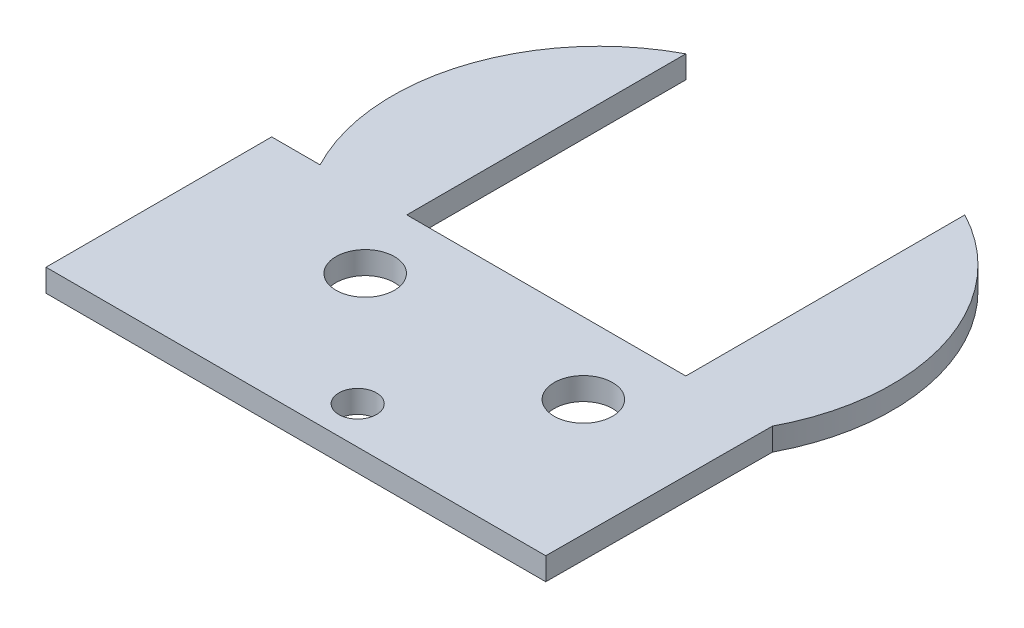
ISO-10303-21;
HEADER;
FILE_DESCRIPTION(('STEP AP214'),'2;1');
FILE_NAME('part.step','',(''),(''),'','','');
FILE_SCHEMA(('AUTOMOTIVE_DESIGN { 1 0 10303 214 1 1 1 1 }'));
ENDSEC;
DATA;
#1=APPLICATION_CONTEXT('core data for automotive mechanical design processes');
#2=APPLICATION_PROTOCOL_DEFINITION('international standard','automotive_design',2000,#1);
#3=PRODUCT_CONTEXT('',#1,'mechanical');
#4=PRODUCT('Part','Part','',(#3));
#5=PRODUCT_RELATED_PRODUCT_CATEGORY('part','',(#4));
#6=PRODUCT_DEFINITION_FORMATION('','',#4);
#7=PRODUCT_DEFINITION_CONTEXT('part definition',#1,'design');
#8=PRODUCT_DEFINITION('design','',#6,#7);
#9=PRODUCT_DEFINITION_SHAPE('','',#8);
#10=(LENGTH_UNIT() NAMED_UNIT(*) SI_UNIT(.MILLI.,.METRE.));
#11=(NAMED_UNIT(*) PLANE_ANGLE_UNIT() SI_UNIT($,.RADIAN.));
#12=(NAMED_UNIT(*) SI_UNIT($,.STERADIAN.) SOLID_ANGLE_UNIT());
#13=UNCERTAINTY_MEASURE_WITH_UNIT(LENGTH_MEASURE(1.E-05),#10,'distance_accuracy_value','');
#14=(GEOMETRIC_REPRESENTATION_CONTEXT(3) GLOBAL_UNCERTAINTY_ASSIGNED_CONTEXT((#13)) GLOBAL_UNIT_ASSIGNED_CONTEXT((#10,
#11,#12)) REPRESENTATION_CONTEXT('',''));
#15=CARTESIAN_POINT('',(0.,0.,0.));
#16=DIRECTION('',(0.,0.,1.));
#17=DIRECTION('',(1.,0.,0.));
#18=AXIS2_PLACEMENT_3D('',#15,#16,#17);
#19=CARTESIAN_POINT('',(-19.773849265644,3.,0.));
#20=DIRECTION('',(-1.,0.,0.));
#21=DIRECTION('',(0.,0.,1.));
#22=AXIS2_PLACEMENT_3D('',#19,#20,#21);
#23=PLANE('',#22);
#24=DIRECTION('',(0.,0.,-1.));
#25=VECTOR('',#24,1.);
#26=CARTESIAN_POINT('',(-19.773849265644,0.,0.));
#27=LINE('',#26,#25);
#28=CARTESIAN_POINT('',(-19.773849265644,0.,0.));
#29=VERTEX_POINT('',#28);
#30=CARTESIAN_POINT('',(-19.773849265644,0.,-37.0896151305009));
#31=VERTEX_POINT('',#30);
#32=EDGE_CURVE('E136',#29,#31,#27,.T.);
#33=ORIENTED_EDGE('',*,*,#32,.T.);
#34=DIRECTION('',(0.,-1.,0.));
#35=VECTOR('',#34,1.);
#36=CARTESIAN_POINT('',(-19.773849265644,3.,-37.0896151305009));
#37=LINE('',#36,#35);
#38=CARTESIAN_POINT('',(-19.773849265644,3.,-37.0896151305009));
#39=VERTEX_POINT('',#38);
#40=EDGE_CURVE('E11',#39,#31,#37,.T.);
#41=ORIENTED_EDGE('',*,*,#40,.F.);
#42=DIRECTION('',(0.,0.,-1.));
#43=VECTOR('',#42,1.);
#44=CARTESIAN_POINT('',(-19.773849265644,3.,0.));
#45=LINE('',#44,#43);
#46=CARTESIAN_POINT('',(-19.773849265644,3.,0.));
#47=VERTEX_POINT('',#46);
#48=EDGE_CURVE('E152',#47,#39,#45,.T.);
#49=ORIENTED_EDGE('',*,*,#48,.F.);
#50=DIRECTION('',(0.,-1.,0.));
#51=VECTOR('',#50,1.);
#52=CARTESIAN_POINT('',(-19.773849265644,3.,0.));
#53=LINE('',#52,#51);
#54=EDGE_CURVE('E132',#47,#29,#53,.T.);
#55=ORIENTED_EDGE('',*,*,#54,.T.);
#56=EDGE_LOOP('',(#33,#41,#49,#55));
#57=FACE_BOUND('',#56,.T.);
#58=ADVANCED_FACE('F33',(#57),#23,.F.);
#59=CARTESIAN_POINT('',(-6.99296837607949,3.,-12.7808808895645));
#60=DIRECTION('',(0.,-1.,0.));
#61=DIRECTION('',(0.,0.,-1.));
#62=AXIS2_PLACEMENT_3D('',#59,#60,#61);
#63=CYLINDRICAL_SURFACE('',#62,27.4638940558274);
#64=CARTESIAN_POINT('',(-6.99296837607949,0.,-12.7808808895645));
#65=DIRECTION('',(0.,1.,0.));
#66=DIRECTION('',(0.,0.,1.));
#67=AXIS2_PLACEMENT_3D('',#64,#65,#66);
#68=CIRCLE('',#67,27.4638940558274);
#69=CARTESIAN_POINT('',(-31.3017026170159,0.,0.));
#70=VERTEX_POINT('',#69);
#71=EDGE_CURVE('E139',#31,#70,#68,.T.);
#72=ORIENTED_EDGE('',*,*,#71,.T.);
#73=DIRECTION('',(0.,-1.,0.));
#74=VECTOR('',#73,1.);
#75=CARTESIAN_POINT('',(-31.3017026170159,3.,0.));
#76=LINE('',#75,#74);
#77=CARTESIAN_POINT('',(-31.3017026170159,3.,0.));
#78=VERTEX_POINT('',#77);
#79=EDGE_CURVE('E42',#78,#70,#76,.T.);
#80=ORIENTED_EDGE('',*,*,#79,.F.);
#81=CARTESIAN_POINT('',(-6.99296837607949,3.,-12.7808808895645));
#82=DIRECTION('',(0.,1.,0.));
#83=DIRECTION('',(0.,0.,1.));
#84=AXIS2_PLACEMENT_3D('',#81,#82,#83);
#85=CIRCLE('',#84,27.4638940558274);
#86=EDGE_CURVE('E96',#39,#78,#85,.T.);
#87=ORIENTED_EDGE('',*,*,#86,.F.);
#88=ORIENTED_EDGE('',*,*,#40,.T.);
#89=EDGE_LOOP('',(#72,#80,#87,#88));
#90=FACE_BOUND('',#89,.T.);
#91=ADVANCED_FACE('F232',(#90),#63,.T.);
#92=CARTESIAN_POINT('',(-37.7335480750406,3.,0.));
#93=DIRECTION('',(0.,0.,1.));
#94=DIRECTION('',(1.,0.,0.));
#95=AXIS2_PLACEMENT_3D('',#92,#93,#94);
#96=PLANE('',#95);
#97=DIRECTION('',(-1.,0.,0.));
#98=VECTOR('',#97,1.);
#99=CARTESIAN_POINT('',(-37.7335480750406,0.,0.));
#100=LINE('',#99,#98);
#101=CARTESIAN_POINT('',(-37.7335480750406,0.,0.));
#102=VERTEX_POINT('',#101);
#103=EDGE_CURVE('E141',#70,#102,#100,.T.);
#104=ORIENTED_EDGE('',*,*,#103,.T.);
#105=DIRECTION('',(0.,-1.,0.));
#106=VECTOR('',#105,1.);
#107=CARTESIAN_POINT('',(-37.7335480750406,3.,0.));
#108=LINE('',#107,#106);
#109=CARTESIAN_POINT('',(-37.7335480750406,3.,0.));
#110=VERTEX_POINT('',#109);
#111=EDGE_CURVE('E162',#110,#102,#108,.T.);
#112=ORIENTED_EDGE('',*,*,#111,.F.);
#113=DIRECTION('',(-1.,0.,0.));
#114=VECTOR('',#113,1.);
#115=CARTESIAN_POINT('',(-37.7335480750406,3.,0.));
#116=LINE('',#115,#114);
#117=EDGE_CURVE('E171',#78,#110,#116,.T.);
#118=ORIENTED_EDGE('',*,*,#117,.F.);
#119=ORIENTED_EDGE('',*,*,#79,.T.);
#120=EDGE_LOOP('',(#104,#112,#118,#119));
#121=FACE_BOUND('',#120,.T.);
#122=ADVANCED_FACE('F169',(#121),#96,.F.);
#123=CARTESIAN_POINT('',(-37.7335480750406,3.,30.));
#124=DIRECTION('',(1.,0.,0.));
#125=DIRECTION('',(0.,0.,-1.));
#126=AXIS2_PLACEMENT_3D('',#123,#124,#125);
#127=PLANE('',#126);
#128=DIRECTION('',(0.,0.,1.));
#129=VECTOR('',#128,1.);
#130=CARTESIAN_POINT('',(-37.7335480750406,0.,30.));
#131=LINE('',#130,#129);
#132=CARTESIAN_POINT('',(-37.7335480750406,0.,30.));
#133=VERTEX_POINT('',#132);
#134=EDGE_CURVE('E143',#102,#133,#131,.T.);
#135=ORIENTED_EDGE('',*,*,#134,.T.);
#136=DIRECTION('',(0.,-1.,0.));
#137=VECTOR('',#136,1.);
#138=CARTESIAN_POINT('',(-37.7335480750406,3.,30.));
#139=LINE('',#138,#137);
#140=CARTESIAN_POINT('',(-37.7335480750406,3.,30.));
#141=VERTEX_POINT('',#140);
#142=EDGE_CURVE('E159',#141,#133,#139,.T.);
#143=ORIENTED_EDGE('',*,*,#142,.F.);
#144=DIRECTION('',(0.,0.,1.));
#145=VECTOR('',#144,1.);
#146=CARTESIAN_POINT('',(-37.7335480750406,3.,30.));
#147=LINE('',#146,#145);
#148=EDGE_CURVE('E187',#110,#141,#147,.T.);
#149=ORIENTED_EDGE('',*,*,#148,.F.);
#150=ORIENTED_EDGE('',*,*,#111,.T.);
#151=EDGE_LOOP('',(#135,#143,#149,#150));
#152=FACE_BOUND('',#151,.T.);
#153=ADVANCED_FACE('F180',(#152),#127,.F.);
#154=CARTESIAN_POINT('',(-37.7335480750406,3.,30.));
#155=DIRECTION('',(0.,0.,-1.));
#156=DIRECTION('',(-1.,0.,0.));
#157=AXIS2_PLACEMENT_3D('',#154,#155,#156);
#158=PLANE('',#157);
#159=DIRECTION('',(1.,0.,0.));
#160=VECTOR('',#159,1.);
#161=CARTESIAN_POINT('',(-37.7335480750406,0.,30.));
#162=LINE('',#161,#160);
#163=CARTESIAN_POINT('',(28.6982973829841,0.,30.));
#164=VERTEX_POINT('',#163);
#165=EDGE_CURVE('E145',#133,#164,#162,.T.);
#166=ORIENTED_EDGE('',*,*,#165,.T.);
#167=DIRECTION('',(0.,-1.,0.));
#168=VECTOR('',#167,1.);
#169=CARTESIAN_POINT('',(28.6982973829841,3.,30.));
#170=LINE('',#169,#168);
#171=CARTESIAN_POINT('',(28.6982973829841,3.,30.));
#172=VERTEX_POINT('',#171);
#173=EDGE_CURVE('E156',#172,#164,#170,.T.);
#174=ORIENTED_EDGE('',*,*,#173,.F.);
#175=DIRECTION('',(1.,0.,0.));
#176=VECTOR('',#175,1.);
#177=CARTESIAN_POINT('',(-37.7335480750406,3.,30.));
#178=LINE('',#177,#176);
#179=EDGE_CURVE('E186',#141,#172,#178,.T.);
#180=ORIENTED_EDGE('',*,*,#179,.F.);
#181=ORIENTED_EDGE('',*,*,#142,.T.);
#182=EDGE_LOOP('',(#166,#174,#180,#181));
#183=FACE_BOUND('',#182,.T.);
#184=ADVANCED_FACE('F184',(#183),#158,.F.);
#185=CARTESIAN_POINT('',(28.6982973829841,3.,30.));
#186=DIRECTION('',(-0.999988267742462,0.,-0.00484400427638674));
#187=DIRECTION('',(-0.00484400427638674,0.,0.999988267742462));
#188=AXIS2_PLACEMENT_3D('',#185,#186,#187);
#189=PLANE('',#188);
#190=DIRECTION('',(0.00484400427638674,0.,-0.999988267742462));
#191=VECTOR('',#190,1.);
#192=CARTESIAN_POINT('',(28.6982973829841,0.,30.));
#193=LINE('',#192,#191);
#194=CARTESIAN_POINT('',(28.8436192162289,0.,0.));
#195=VERTEX_POINT('',#194);
#196=EDGE_CURVE('E147',#164,#195,#193,.T.);
#197=ORIENTED_EDGE('',*,*,#196,.T.);
#198=DIRECTION('',(0.,-1.,0.));
#199=VECTOR('',#198,1.);
#200=CARTESIAN_POINT('',(28.8436192162289,3.,0.));
#201=LINE('',#200,#199);
#202=CARTESIAN_POINT('',(28.8436192162289,3.,0.));
#203=VERTEX_POINT('',#202);
#204=EDGE_CURVE('E127',#203,#195,#201,.T.);
#205=ORIENTED_EDGE('',*,*,#204,.F.);
#206=DIRECTION('',(0.00484400427638674,0.,-0.999988267742462));
#207=VECTOR('',#206,1.);
#208=CARTESIAN_POINT('',(28.6982973829841,3.,30.));
#209=LINE('',#208,#207);
#210=EDGE_CURVE('E118',#172,#203,#209,.T.);
#211=ORIENTED_EDGE('',*,*,#210,.F.);
#212=ORIENTED_EDGE('',*,*,#173,.T.);
#213=EDGE_LOOP('',(#197,#205,#211,#212));
#214=FACE_BOUND('',#213,.T.);
#215=ADVANCED_FACE('F240',(#214),#189,.F.);
#216=CARTESIAN_POINT('',(4.53488497529242,3.,-12.7808808895645));
#217=DIRECTION('',(0.,-1.,0.));
#218=DIRECTION('',(0.,0.,-1.));
#219=AXIS2_PLACEMENT_3D('',#216,#217,#218);
#220=CYLINDRICAL_SURFACE('',#219,27.4638940558274);
#221=CARTESIAN_POINT('',(4.53488497529242,0.,-12.7808808895645));
#222=DIRECTION('',(0.,1.,0.));
#223=DIRECTION('',(0.,0.,-1.));
#224=AXIS2_PLACEMENT_3D('',#221,#222,#223);
#225=CIRCLE('',#224,27.4638940558274);
#226=CARTESIAN_POINT('',(17.3157658648569,0.,-37.0896151305009));
#227=VERTEX_POINT('',#226);
#228=EDGE_CURVE('E126',#195,#227,#225,.T.);
#229=ORIENTED_EDGE('',*,*,#228,.T.);
#230=DIRECTION('',(0.,-1.,0.));
#231=VECTOR('',#230,1.);
#232=CARTESIAN_POINT('',(17.3157658648569,3.,-37.0896151305009));
#233=LINE('',#232,#231);
#234=CARTESIAN_POINT('',(17.3157658648569,3.,-37.0896151305009));
#235=VERTEX_POINT('',#234);
#236=EDGE_CURVE('E123',#235,#227,#233,.T.);
#237=ORIENTED_EDGE('',*,*,#236,.F.);
#238=CARTESIAN_POINT('',(4.53488497529242,3.,-12.7808808895645));
#239=DIRECTION('',(0.,1.,0.));
#240=DIRECTION('',(0.,0.,-1.));
#241=AXIS2_PLACEMENT_3D('',#238,#239,#240);
#242=CIRCLE('',#241,27.4638940558274);
#243=EDGE_CURVE('E112',#203,#235,#242,.T.);
#244=ORIENTED_EDGE('',*,*,#243,.F.);
#245=ORIENTED_EDGE('',*,*,#204,.T.);
#246=EDGE_LOOP('',(#229,#237,#244,#245));
#247=FACE_BOUND('',#246,.T.);
#248=ADVANCED_FACE('F124',(#247),#220,.T.);
#249=CARTESIAN_POINT('',(17.3157658648569,3.,0.));
#250=DIRECTION('',(1.,0.,0.));
#251=DIRECTION('',(0.,0.,-1.));
#252=AXIS2_PLACEMENT_3D('',#249,#250,#251);
#253=PLANE('',#252);
#254=DIRECTION('',(0.,0.,1.));
#255=VECTOR('',#254,1.);
#256=CARTESIAN_POINT('',(17.3157658648569,0.,0.));
#257=LINE('',#256,#255);
#258=CARTESIAN_POINT('',(17.3157658648569,0.,0.));
#259=VERTEX_POINT('',#258);
#260=EDGE_CURVE('E82',#227,#259,#257,.T.);
#261=ORIENTED_EDGE('',*,*,#260,.T.);
#262=DIRECTION('',(0.,-1.,0.));
#263=VECTOR('',#262,1.);
#264=CARTESIAN_POINT('',(17.3157658648569,3.,0.));
#265=LINE('',#264,#263);
#266=CARTESIAN_POINT('',(17.3157658648569,3.,0.));
#267=VERTEX_POINT('',#266);
#268=EDGE_CURVE('E128',#267,#259,#265,.T.);
#269=ORIENTED_EDGE('',*,*,#268,.F.);
#270=DIRECTION('',(0.,0.,1.));
#271=VECTOR('',#270,1.);
#272=CARTESIAN_POINT('',(17.3157658648569,3.,0.));
#273=LINE('',#272,#271);
#274=EDGE_CURVE('E116',#235,#267,#273,.T.);
#275=ORIENTED_EDGE('',*,*,#274,.F.);
#276=ORIENTED_EDGE('',*,*,#236,.T.);
#277=EDGE_LOOP('',(#261,#269,#275,#276));
#278=FACE_BOUND('',#277,.T.);
#279=ADVANCED_FACE('F130',(#278),#253,.F.);
#280=CARTESIAN_POINT('',(-19.773849265644,3.,0.));
#281=DIRECTION('',(0.,0.,1.));
#282=DIRECTION('',(1.,0.,0.));
#283=AXIS2_PLACEMENT_3D('',#280,#281,#282);
#284=PLANE('',#283);
#285=DIRECTION('',(-1.,0.,0.));
#286=VECTOR('',#285,1.);
#287=CARTESIAN_POINT('',(-19.773849265644,0.,0.));
#288=LINE('',#287,#286);
#289=EDGE_CURVE('E88',#259,#29,#288,.T.);
#290=ORIENTED_EDGE('',*,*,#289,.T.);
#291=ORIENTED_EDGE('',*,*,#54,.F.);
#292=DIRECTION('',(-1.,0.,0.));
#293=VECTOR('',#292,1.);
#294=CARTESIAN_POINT('',(-19.773849265644,3.,0.));
#295=LINE('',#294,#293);
#296=EDGE_CURVE('E50',#267,#47,#295,.T.);
#297=ORIENTED_EDGE('',*,*,#296,.F.);
#298=ORIENTED_EDGE('',*,*,#268,.T.);
#299=EDGE_LOOP('',(#290,#291,#297,#298));
#300=FACE_BOUND('',#299,.T.);
#301=ADVANCED_FACE('F285',(#300),#284,.F.);
#302=CARTESIAN_POINT('',(-6.99296837607949,3.,-12.7808808895645));
#303=DIRECTION('',(0.,1.,0.));
#304=DIRECTION('',(0.,0.,1.));
#305=AXIS2_PLACEMENT_3D('',#302,#303,#304);
#306=PLANE('',#305);
#307=CARTESIAN_POINT('',(13.1982973830094,3.,9.5));
#308=DIRECTION('',(0.,1.,0.));
#309=DIRECTION('',(0.,0.,1.));
#310=AXIS2_PLACEMENT_3D('',#307,#308,#309);
#311=CIRCLE('',#310,3.88143107176716);
#312=CARTESIAN_POINT('',(13.1982973830094,3.,13.3814310717672));
#313=VERTEX_POINT('',#312);
#314=EDGE_CURVE('E197',#313,#313,#311,.T.);
#315=ORIENTED_EDGE('',*,*,#314,.F.);
#316=EDGE_LOOP('',(#315));
#317=FACE_BOUND('',#316,.T.);
#318=CARTESIAN_POINT('',(-15.8017026169906,3.,9.49999999999999));
#319=DIRECTION('',(0.,1.,0.));
#320=DIRECTION('',(0.,0.,1.));
#321=AXIS2_PLACEMENT_3D('',#318,#319,#320);
#322=CIRCLE('',#321,3.88143107176716);
#323=CARTESIAN_POINT('',(-15.8017026169906,3.,13.3814310717672));
#324=VERTEX_POINT('',#323);
#325=EDGE_CURVE('E200',#324,#324,#322,.T.);
#326=ORIENTED_EDGE('',*,*,#325,.F.);
#327=EDGE_LOOP('',(#326));
#328=FACE_BOUND('',#327,.T.);
#329=CARTESIAN_POINT('',(-1.30170261699063,3.,25.));
#330=DIRECTION('',(0.,1.,0.));
#331=DIRECTION('',(0.,0.,1.));
#332=AXIS2_PLACEMENT_3D('',#329,#330,#331);
#333=CIRCLE('',#332,2.5);
#334=CARTESIAN_POINT('',(-1.30170261699063,3.,27.5));
#335=VERTEX_POINT('',#334);
#336=EDGE_CURVE('E194',#335,#335,#333,.T.);
#337=ORIENTED_EDGE('',*,*,#336,.F.);
#338=EDGE_LOOP('',(#337));
#339=FACE_BOUND('',#338,.T.);
#340=ORIENTED_EDGE('',*,*,#48,.T.);
#341=ORIENTED_EDGE('',*,*,#86,.T.);
#342=ORIENTED_EDGE('',*,*,#117,.T.);
#343=ORIENTED_EDGE('',*,*,#148,.T.);
#344=ORIENTED_EDGE('',*,*,#179,.T.);
#345=ORIENTED_EDGE('',*,*,#210,.T.);
#346=ORIENTED_EDGE('',*,*,#243,.T.);
#347=ORIENTED_EDGE('',*,*,#274,.T.);
#348=ORIENTED_EDGE('',*,*,#296,.T.);
#349=EDGE_LOOP('',(#340,#341,#342,#343,#344,#345,#346,#347,#348));
#350=FACE_BOUND('',#349,.T.);
#351=ADVANCED_FACE('F114',(#317,#328,#339,#350),#306,.T.);
#352=CARTESIAN_POINT('',(-6.99296837607949,0.,-12.7808808895645));
#353=DIRECTION('',(0.,1.,0.));
#354=DIRECTION('',(0.,0.,1.));
#355=AXIS2_PLACEMENT_3D('',#352,#353,#354);
#356=PLANE('',#355);
#357=CARTESIAN_POINT('',(13.1982973830094,0.,9.5));
#358=DIRECTION('',(0.,-1.,0.));
#359=DIRECTION('',(0.,0.,-1.));
#360=AXIS2_PLACEMENT_3D('',#357,#358,#359);
#361=CIRCLE('',#360,3.88143107176716);
#362=CARTESIAN_POINT('',(13.1982973830094,0.,5.61856892823284));
#363=VERTEX_POINT('',#362);
#364=EDGE_CURVE('E203',#363,#363,#361,.T.);
#365=ORIENTED_EDGE('',*,*,#364,.F.);
#366=EDGE_LOOP('',(#365));
#367=FACE_BOUND('',#366,.T.);
#368=CARTESIAN_POINT('',(-15.8017026169906,0.,9.49999999999999));
#369=DIRECTION('',(0.,-1.,0.));
#370=DIRECTION('',(0.,0.,1.));
#371=AXIS2_PLACEMENT_3D('',#368,#369,#370);
#372=CIRCLE('',#371,3.88143107176716);
#373=CARTESIAN_POINT('',(-15.8017026169906,0.,13.3814310717672));
#374=VERTEX_POINT('',#373);
#375=EDGE_CURVE('E204',#374,#374,#372,.T.);
#376=ORIENTED_EDGE('',*,*,#375,.F.);
#377=EDGE_LOOP('',(#376));
#378=FACE_BOUND('',#377,.T.);
#379=CARTESIAN_POINT('',(-1.30170261699063,0.,25.));
#380=DIRECTION('',(0.,1.,0.));
#381=DIRECTION('',(0.,0.,1.));
#382=AXIS2_PLACEMENT_3D('',#379,#380,#381);
#383=CIRCLE('',#382,2.5);
#384=CARTESIAN_POINT('',(-1.30170261699063,0.,27.5));
#385=VERTEX_POINT('',#384);
#386=EDGE_CURVE('E36',#385,#385,#383,.T.);
#387=ORIENTED_EDGE('',*,*,#386,.T.);
#388=EDGE_LOOP('',(#387));
#389=FACE_BOUND('',#388,.T.);
#390=ORIENTED_EDGE('',*,*,#32,.F.);
#391=ORIENTED_EDGE('',*,*,#289,.F.);
#392=ORIENTED_EDGE('',*,*,#260,.F.);
#393=ORIENTED_EDGE('',*,*,#228,.F.);
#394=ORIENTED_EDGE('',*,*,#196,.F.);
#395=ORIENTED_EDGE('',*,*,#165,.F.);
#396=ORIENTED_EDGE('',*,*,#134,.F.);
#397=ORIENTED_EDGE('',*,*,#103,.F.);
#398=ORIENTED_EDGE('',*,*,#71,.F.);
#399=EDGE_LOOP('',(#390,#391,#392,#393,#394,#395,#396,#397,#398));
#400=FACE_BOUND('',#399,.T.);
#401=ADVANCED_FACE('F175',(#367,#378,#389,#400),#356,.F.);
#402=CARTESIAN_POINT('',(-1.30170261699063,-17.,25.));
#403=DIRECTION('',(0.,1.,0.));
#404=DIRECTION('',(0.,0.,1.));
#405=AXIS2_PLACEMENT_3D('',#402,#403,#404);
#406=CYLINDRICAL_SURFACE('',#405,2.5);
#407=ORIENTED_EDGE('',*,*,#336,.T.);
#408=EDGE_LOOP('',(#407));
#409=FACE_BOUND('',#408,.T.);
#410=ORIENTED_EDGE('',*,*,#386,.F.);
#411=EDGE_LOOP('',(#410));
#412=FACE_BOUND('',#411,.T.);
#413=ADVANCED_FACE('F214',(#409,#412),#406,.F.);
#414=CARTESIAN_POINT('',(-15.8017026169906,10.,9.49999999999999));
#415=DIRECTION('',(0.,-1.,0.));
#416=DIRECTION('',(0.,0.,-1.));
#417=AXIS2_PLACEMENT_3D('',#414,#415,#416);
#418=CYLINDRICAL_SURFACE('',#417,3.88143107176716);
#419=ORIENTED_EDGE('',*,*,#325,.T.);
#420=EDGE_LOOP('',(#419));
#421=FACE_BOUND('',#420,.T.);
#422=ORIENTED_EDGE('',*,*,#375,.T.);
#423=EDGE_LOOP('',(#422));
#424=FACE_BOUND('',#423,.T.);
#425=ADVANCED_FACE('F222',(#421,#424),#418,.F.);
#426=CARTESIAN_POINT('',(13.1982973830094,10.,9.5));
#427=DIRECTION('',(0.,-1.,0.));
#428=DIRECTION('',(0.,0.,-1.));
#429=AXIS2_PLACEMENT_3D('',#426,#427,#428);
#430=CYLINDRICAL_SURFACE('',#429,3.88143107176716);
#431=ORIENTED_EDGE('',*,*,#314,.T.);
#432=EDGE_LOOP('',(#431));
#433=FACE_BOUND('',#432,.T.);
#434=ORIENTED_EDGE('',*,*,#364,.T.);
#435=EDGE_LOOP('',(#434));
#436=FACE_BOUND('',#435,.T.);
#437=ADVANCED_FACE('F210',(#433,#436),#430,.F.);
#438=CLOSED_SHELL('',(#58,#91,#122,#153,#184,#215,#248,#279,#301,#351,#401,#413,#425,#437));
#439=MANIFOLD_SOLID_BREP('B2',#438);
#440=ADVANCED_BREP_SHAPE_REPRESENTATION('',(#18,#439),#14);
#441=SHAPE_DEFINITION_REPRESENTATION(#9,#440);
ENDSEC;
END-ISO-10303-21;
